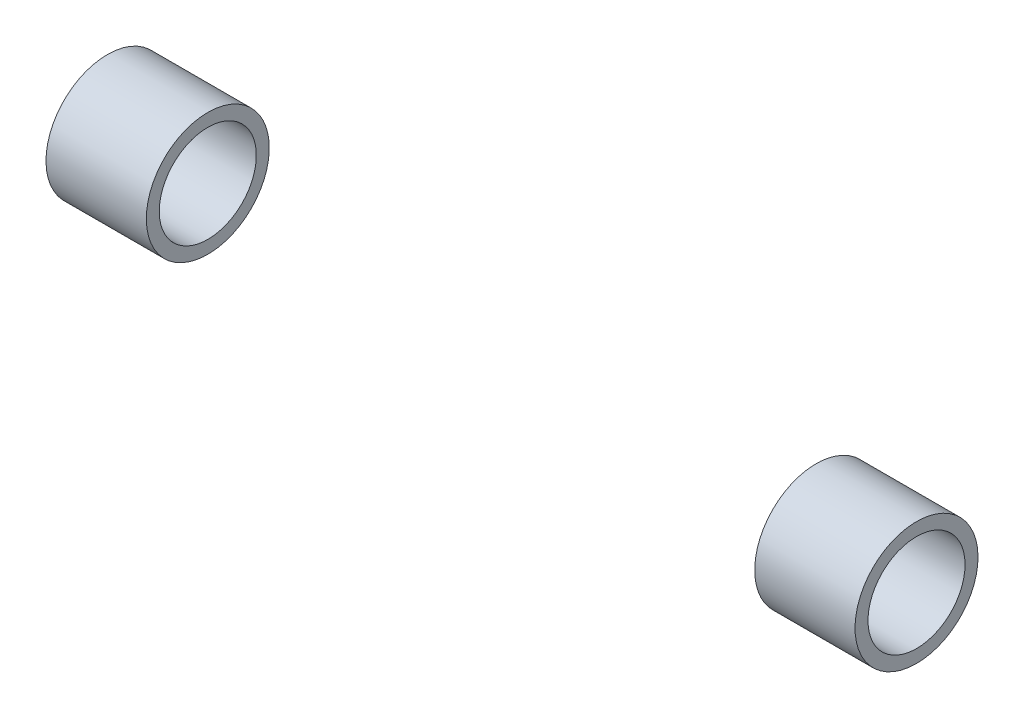
ISO-10303-21;
HEADER;
FILE_DESCRIPTION(('STEP AP214'),'2;1');
FILE_NAME('part.step','',(''),(''),'','','');
FILE_SCHEMA(('AUTOMOTIVE_DESIGN { 1 0 10303 214 1 1 1 1 }'));
ENDSEC;
DATA;
#1=APPLICATION_CONTEXT('core data for automotive mechanical design processes');
#2=APPLICATION_PROTOCOL_DEFINITION('international standard','automotive_design',2000,#1);
#3=PRODUCT_CONTEXT('',#1,'mechanical');
#4=PRODUCT('Part','Part','',(#3));
#5=PRODUCT_RELATED_PRODUCT_CATEGORY('part','',(#4));
#6=PRODUCT_DEFINITION_FORMATION('','',#4);
#7=PRODUCT_DEFINITION_CONTEXT('part definition',#1,'design');
#8=PRODUCT_DEFINITION('design','',#6,#7);
#9=PRODUCT_DEFINITION_SHAPE('','',#8);
#10=(LENGTH_UNIT() NAMED_UNIT(*) SI_UNIT(.MILLI.,.METRE.));
#11=(NAMED_UNIT(*) PLANE_ANGLE_UNIT() SI_UNIT($,.RADIAN.));
#12=(NAMED_UNIT(*) SI_UNIT($,.STERADIAN.) SOLID_ANGLE_UNIT());
#13=UNCERTAINTY_MEASURE_WITH_UNIT(LENGTH_MEASURE(1.E-05),#10,'distance_accuracy_value','');
#14=(GEOMETRIC_REPRESENTATION_CONTEXT(3) GLOBAL_UNCERTAINTY_ASSIGNED_CONTEXT((#13)) GLOBAL_UNIT_ASSIGNED_CONTEXT((#10,
#11,#12)) REPRESENTATION_CONTEXT('',''));
#15=CARTESIAN_POINT('',(0.,0.,0.));
#16=DIRECTION('',(0.,0.,1.));
#17=DIRECTION('',(1.,0.,0.));
#18=AXIS2_PLACEMENT_3D('',#15,#16,#17);
#19=CARTESIAN_POINT('',(12.5,30.,81.));
#20=DIRECTION('',(-1.,0.,0.));
#21=DIRECTION('',(0.,0.746654905866277,0.66521158404362));
#22=AXIS2_PLACEMENT_3D('',#19,#20,#21);
#23=CYLINDRICAL_SURFACE('',#22,1.5);
#24=CARTESIAN_POINT('',(9.4,30.,81.));
#25=DIRECTION('',(1.,0.,0.));
#26=DIRECTION('',(0.,0.,-1.));
#27=AXIS2_PLACEMENT_3D('',#24,#25,#26);
#28=CIRCLE('',#27,1.5);
#29=CARTESIAN_POINT('',(9.4,30.,79.5));
#30=VERTEX_POINT('',#29);
#31=EDGE_CURVE('E12',#30,#30,#28,.T.);
#32=ORIENTED_EDGE('',*,*,#31,.F.);
#33=EDGE_LOOP('',(#32));
#34=FACE_BOUND('',#33,.T.);
#35=CARTESIAN_POINT('',(12.5,30.,81.));
#36=DIRECTION('',(1.,0.,0.));
#37=DIRECTION('',(0.,-0.746654905866277,-0.66521158404362));
#38=AXIS2_PLACEMENT_3D('',#35,#36,#37);
#39=CIRCLE('',#38,1.5);
#40=CARTESIAN_POINT('',(12.5,28.8800176412005,80.0021826239346));
#41=VERTEX_POINT('',#40);
#42=EDGE_CURVE('E78',#41,#41,#39,.T.);
#43=ORIENTED_EDGE('',*,*,#42,.T.);
#44=EDGE_LOOP('',(#43));
#45=FACE_BOUND('',#44,.T.);
#46=ADVANCED_FACE('F53',(#34,#45),#23,.F.);
#47=CARTESIAN_POINT('',(12.5,30.,81.));
#48=DIRECTION('',(1.,0.,0.));
#49=DIRECTION('',(0.,0.,-1.));
#50=AXIS2_PLACEMENT_3D('',#47,#48,#49);
#51=PLANE('',#50);
#52=ORIENTED_EDGE('',*,*,#42,.F.);
#53=EDGE_LOOP('',(#52));
#54=FACE_BOUND('',#53,.T.);
#55=CARTESIAN_POINT('',(12.5,30.,81.));
#56=DIRECTION('',(1.,0.,0.));
#57=DIRECTION('',(0.,-0.746654905866276,-0.66521158404362));
#58=AXIS2_PLACEMENT_3D('',#55,#56,#57);
#59=CIRCLE('',#58,1.9);
#60=CARTESIAN_POINT('',(12.5,28.581355678854,79.7360979903172));
#61=VERTEX_POINT('',#60);
#62=EDGE_CURVE('E84',#61,#61,#59,.T.);
#63=ORIENTED_EDGE('',*,*,#62,.T.);
#64=EDGE_LOOP('',(#63));
#65=FACE_BOUND('',#64,.T.);
#66=ADVANCED_FACE('F85',(#54,#65),#51,.T.);
#67=CARTESIAN_POINT('',(9.4,30.,81.));
#68=DIRECTION('',(1.,0.,0.));
#69=DIRECTION('',(0.,-0.746654905866276,-0.66521158404362));
#70=AXIS2_PLACEMENT_3D('',#67,#68,#69);
#71=CYLINDRICAL_SURFACE('',#70,1.9);
#72=CARTESIAN_POINT('',(9.4,30.,81.));
#73=DIRECTION('',(1.,0.,0.));
#74=DIRECTION('',(0.,-0.746654905866276,-0.66521158404362));
#75=AXIS2_PLACEMENT_3D('',#72,#73,#74);
#76=CIRCLE('',#75,1.9);
#77=CARTESIAN_POINT('',(9.4,28.581355678854,79.7360979903172));
#78=VERTEX_POINT('',#77);
#79=EDGE_CURVE('E62',#78,#78,#76,.T.);
#80=ORIENTED_EDGE('',*,*,#79,.T.);
#81=EDGE_LOOP('',(#80));
#82=FACE_BOUND('',#81,.T.);
#83=ORIENTED_EDGE('',*,*,#62,.F.);
#84=EDGE_LOOP('',(#83));
#85=FACE_BOUND('',#84,.T.);
#86=ADVANCED_FACE('F55',(#82,#85),#71,.T.);
#87=CARTESIAN_POINT('',(9.4,30.,81.));
#88=DIRECTION('',(1.,0.,0.));
#89=DIRECTION('',(0.,0.,-1.));
#90=AXIS2_PLACEMENT_3D('',#87,#88,#89);
#91=PLANE('',#90);
#92=ORIENTED_EDGE('',*,*,#31,.T.);
#93=EDGE_LOOP('',(#92));
#94=FACE_BOUND('',#93,.T.);
#95=ORIENTED_EDGE('',*,*,#79,.F.);
#96=EDGE_LOOP('',(#95));
#97=FACE_BOUND('',#96,.T.);
#98=ADVANCED_FACE('F98',(#94,#97),#91,.F.);
#99=CLOSED_SHELL('',(#46,#66,#86,#98));
#100=MANIFOLD_SOLID_BREP('B2',#99);
#101=CARTESIAN_POINT('',(-9.4,30.,81.));
#102=DIRECTION('',(-1.,0.,0.));
#103=DIRECTION('',(0.,0.746654905866276,0.66521158404362));
#104=AXIS2_PLACEMENT_3D('',#101,#102,#103);
#105=CYLINDRICAL_SURFACE('',#104,1.9);
#106=CARTESIAN_POINT('',(-9.4,30.,81.));
#107=DIRECTION('',(-1.,0.,0.));
#108=DIRECTION('',(0.,0.746654905866276,0.66521158404362));
#109=AXIS2_PLACEMENT_3D('',#106,#107,#108);
#110=CIRCLE('',#109,1.9);
#111=CARTESIAN_POINT('',(-9.4,31.4186443211459,82.2639020096829));
#112=VERTEX_POINT('',#111);
#113=EDGE_CURVE('E51',#112,#112,#110,.T.);
#114=ORIENTED_EDGE('',*,*,#113,.T.);
#115=EDGE_LOOP('',(#114));
#116=FACE_BOUND('',#115,.T.);
#117=CARTESIAN_POINT('',(-12.5,30.,81.));
#118=DIRECTION('',(-1.,0.,0.));
#119=DIRECTION('',(0.,0.746654905866276,0.66521158404362));
#120=AXIS2_PLACEMENT_3D('',#117,#118,#119);
#121=CIRCLE('',#120,1.9);
#122=CARTESIAN_POINT('',(-12.5,31.4186443211459,82.2639020096829));
#123=VERTEX_POINT('',#122);
#124=EDGE_CURVE('E165',#123,#123,#121,.T.);
#125=ORIENTED_EDGE('',*,*,#124,.F.);
#126=EDGE_LOOP('',(#125));
#127=FACE_BOUND('',#126,.T.);
#128=ADVANCED_FACE('F144',(#116,#127),#105,.T.);
#129=CARTESIAN_POINT('',(-9.4,30.,81.));
#130=DIRECTION('',(-1.,0.,0.));
#131=DIRECTION('',(0.,0.,1.));
#132=AXIS2_PLACEMENT_3D('',#129,#130,#131);
#133=PLANE('',#132);
#134=CARTESIAN_POINT('',(-9.4,30.,81.));
#135=DIRECTION('',(-1.,0.,0.));
#136=DIRECTION('',(0.,0.,1.));
#137=AXIS2_PLACEMENT_3D('',#134,#135,#136);
#138=CIRCLE('',#137,1.5);
#139=CARTESIAN_POINT('',(-9.4,30.,82.5));
#140=VERTEX_POINT('',#139);
#141=EDGE_CURVE('E169',#140,#140,#138,.T.);
#142=ORIENTED_EDGE('',*,*,#141,.T.);
#143=EDGE_LOOP('',(#142));
#144=FACE_BOUND('',#143,.T.);
#145=ORIENTED_EDGE('',*,*,#113,.F.);
#146=EDGE_LOOP('',(#145));
#147=FACE_BOUND('',#146,.T.);
#148=ADVANCED_FACE('F178',(#144,#147),#133,.F.);
#149=CARTESIAN_POINT('',(-12.5,30.,81.));
#150=DIRECTION('',(-1.,0.,0.));
#151=DIRECTION('',(0.,0.,1.));
#152=AXIS2_PLACEMENT_3D('',#149,#150,#151);
#153=PLANE('',#152);
#154=CARTESIAN_POINT('',(-12.5,30.,81.));
#155=DIRECTION('',(-1.,0.,0.));
#156=DIRECTION('',(0.,0.746654905866277,0.66521158404362));
#157=AXIS2_PLACEMENT_3D('',#154,#155,#156);
#158=CIRCLE('',#157,1.5);
#159=CARTESIAN_POINT('',(-12.5,31.1199823587994,81.9978173760654));
#160=VERTEX_POINT('',#159);
#161=EDGE_CURVE('E148',#160,#160,#158,.T.);
#162=ORIENTED_EDGE('',*,*,#161,.F.);
#163=EDGE_LOOP('',(#162));
#164=FACE_BOUND('',#163,.T.);
#165=ORIENTED_EDGE('',*,*,#124,.T.);
#166=EDGE_LOOP('',(#165));
#167=FACE_BOUND('',#166,.T.);
#168=ADVANCED_FACE('F166',(#164,#167),#153,.T.);
#169=CARTESIAN_POINT('',(-12.5,30.,81.));
#170=DIRECTION('',(1.,0.,0.));
#171=DIRECTION('',(0.,-0.746654905866277,-0.66521158404362));
#172=AXIS2_PLACEMENT_3D('',#169,#170,#171);
#173=CYLINDRICAL_SURFACE('',#172,1.5);
#174=ORIENTED_EDGE('',*,*,#161,.T.);
#175=EDGE_LOOP('',(#174));
#176=FACE_BOUND('',#175,.T.);
#177=ORIENTED_EDGE('',*,*,#141,.F.);
#178=EDGE_LOOP('',(#177));
#179=FACE_BOUND('',#178,.T.);
#180=ADVANCED_FACE('F146',(#176,#179),#173,.F.);
#181=CLOSED_SHELL('',(#128,#148,#168,#180));
#182=MANIFOLD_SOLID_BREP('B6',#181);
#183=ADVANCED_BREP_SHAPE_REPRESENTATION('',(#18,#100,#182),#14);
#184=SHAPE_DEFINITION_REPRESENTATION(#9,#183);
ENDSEC;
END-ISO-10303-21;
